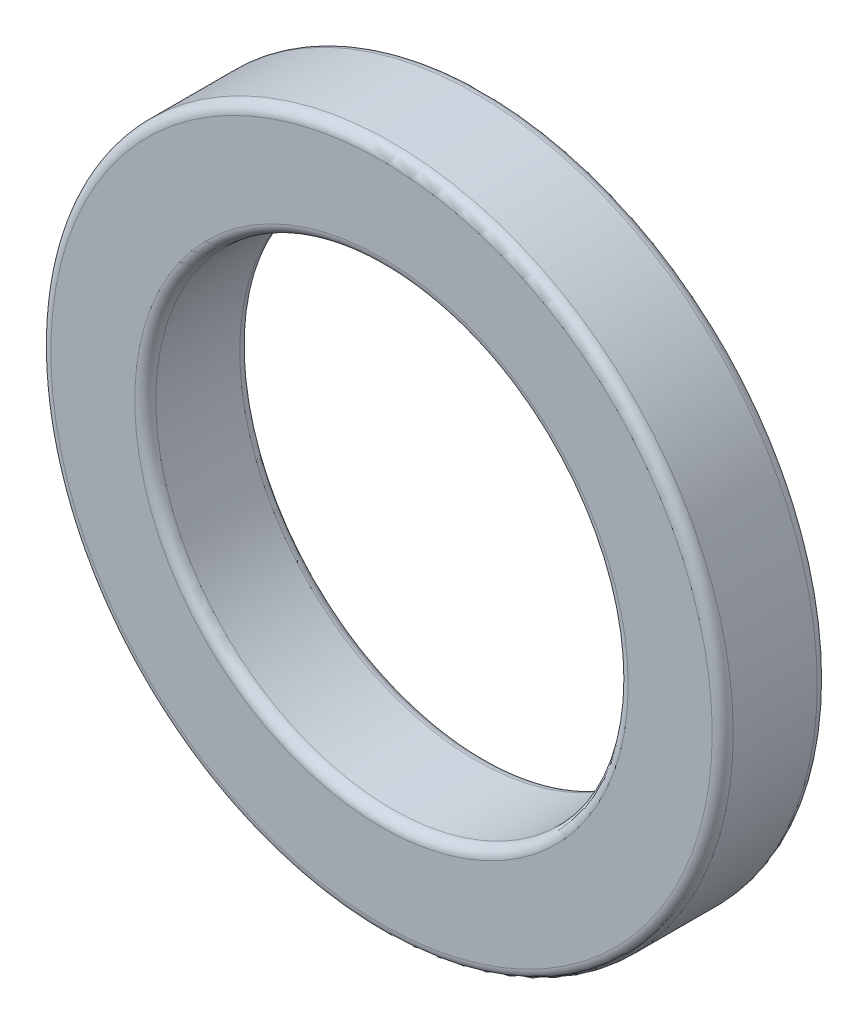
ISO-10303-21;
HEADER;
FILE_DESCRIPTION(('STEP AP214'),'2;1');
FILE_NAME('part.step','',(''),(''),'','','');
FILE_SCHEMA(('AUTOMOTIVE_DESIGN { 1 0 10303 214 1 1 1 1 }'));
ENDSEC;
DATA;
#1=APPLICATION_CONTEXT('core data for automotive mechanical design processes');
#2=APPLICATION_PROTOCOL_DEFINITION('international standard','automotive_design',2000,#1);
#3=PRODUCT_CONTEXT('',#1,'mechanical');
#4=PRODUCT('Part','Part','',(#3));
#5=PRODUCT_RELATED_PRODUCT_CATEGORY('part','',(#4));
#6=PRODUCT_DEFINITION_FORMATION('','',#4);
#7=PRODUCT_DEFINITION_CONTEXT('part definition',#1,'design');
#8=PRODUCT_DEFINITION('design','',#6,#7);
#9=PRODUCT_DEFINITION_SHAPE('','',#8);
#10=(LENGTH_UNIT() NAMED_UNIT(*) SI_UNIT(.MILLI.,.METRE.));
#11=(NAMED_UNIT(*) PLANE_ANGLE_UNIT() SI_UNIT($,.RADIAN.));
#12=(NAMED_UNIT(*) SI_UNIT($,.STERADIAN.) SOLID_ANGLE_UNIT());
#13=UNCERTAINTY_MEASURE_WITH_UNIT(LENGTH_MEASURE(1.E-05),#10,'distance_accuracy_value','');
#14=(GEOMETRIC_REPRESENTATION_CONTEXT(3) GLOBAL_UNCERTAINTY_ASSIGNED_CONTEXT((#13)) GLOBAL_UNIT_ASSIGNED_CONTEXT((#10,
#11,#12)) REPRESENTATION_CONTEXT('',''));
#15=CARTESIAN_POINT('',(0.,0.,0.));
#16=DIRECTION('',(0.,0.,1.));
#17=DIRECTION('',(1.,0.,0.));
#18=AXIS2_PLACEMENT_3D('',#15,#16,#17);
#19=CARTESIAN_POINT('',(0.,0.,2.));
#20=DIRECTION('',(0.,0.,1.));
#21=DIRECTION('',(1.,0.,0.));
#22=AXIS2_PLACEMENT_3D('',#19,#20,#21);
#23=PLANE('',#22);
#24=CARTESIAN_POINT('',(0.,0.,2.));
#25=DIRECTION('',(0.,0.,1.));
#26=DIRECTION('',(1.,0.,0.));
#27=AXIS2_PLACEMENT_3D('',#24,#25,#26);
#28=CIRCLE('',#27,6.3);
#29=CARTESIAN_POINT('',(6.3,0.,2.));
#30=VERTEX_POINT('',#29);
#31=EDGE_CURVE('E42',#30,#30,#28,.T.);
#32=ORIENTED_EDGE('',*,*,#31,.T.);
#33=EDGE_LOOP('',(#32));
#34=FACE_BOUND('',#33,.T.);
#35=CARTESIAN_POINT('',(0.,0.,2.));
#36=DIRECTION('',(0.,0.,1.));
#37=DIRECTION('',(1.,0.,0.));
#38=AXIS2_PLACEMENT_3D('',#35,#36,#37);
#39=CIRCLE('',#38,4.7);
#40=CARTESIAN_POINT('',(4.7,0.,2.));
#41=VERTEX_POINT('',#40);
#42=EDGE_CURVE('E46',#41,#41,#39,.F.);
#43=ORIENTED_EDGE('',*,*,#42,.T.);
#44=EDGE_LOOP('',(#43));
#45=FACE_BOUND('',#44,.T.);
#46=ADVANCED_FACE('F31',(#34,#45),#23,.T.);
#47=CARTESIAN_POINT('',(0.,0.,0.));
#48=DIRECTION('',(0.,0.,1.));
#49=DIRECTION('',(1.,0.,0.));
#50=AXIS2_PLACEMENT_3D('',#47,#48,#49);
#51=PLANE('',#50);
#52=CARTESIAN_POINT('',(0.,0.,0.));
#53=DIRECTION('',(0.,0.,1.));
#54=DIRECTION('',(1.,0.,0.));
#55=AXIS2_PLACEMENT_3D('',#52,#53,#54);
#56=CIRCLE('',#55,6.3);
#57=CARTESIAN_POINT('',(6.3,0.,0.));
#58=VERTEX_POINT('',#57);
#59=EDGE_CURVE('E51',#58,#58,#56,.F.);
#60=ORIENTED_EDGE('',*,*,#59,.T.);
#61=EDGE_LOOP('',(#60));
#62=FACE_BOUND('',#61,.T.);
#63=CARTESIAN_POINT('',(0.,0.,0.));
#64=DIRECTION('',(0.,0.,1.));
#65=DIRECTION('',(1.,0.,0.));
#66=AXIS2_PLACEMENT_3D('',#63,#64,#65);
#67=CIRCLE('',#66,4.7);
#68=CARTESIAN_POINT('',(4.7,0.,0.));
#69=VERTEX_POINT('',#68);
#70=EDGE_CURVE('E54',#69,#69,#67,.T.);
#71=ORIENTED_EDGE('',*,*,#70,.T.);
#72=EDGE_LOOP('',(#71));
#73=FACE_BOUND('',#72,.T.);
#74=ADVANCED_FACE('F76',(#62,#73),#51,.F.);
#75=CARTESIAN_POINT('',(0.,0.,2.));
#76=DIRECTION('',(0.,0.,-1.));
#77=DIRECTION('',(-1.,0.,0.));
#78=AXIS2_PLACEMENT_3D('',#75,#76,#77);
#79=CYLINDRICAL_SURFACE('',#78,6.5);
#80=CARTESIAN_POINT('',(0.,0.,0.2));
#81=DIRECTION('',(0.,0.,1.));
#82=DIRECTION('',(1.,0.,0.));
#83=AXIS2_PLACEMENT_3D('',#80,#81,#82);
#84=CIRCLE('',#83,6.5);
#85=CARTESIAN_POINT('',(6.5,0.,0.2));
#86=VERTEX_POINT('',#85);
#87=EDGE_CURVE('E57',#86,#86,#84,.T.);
#88=ORIENTED_EDGE('',*,*,#87,.T.);
#89=EDGE_LOOP('',(#88));
#90=FACE_BOUND('',#89,.T.);
#91=CARTESIAN_POINT('',(0.,0.,1.8));
#92=DIRECTION('',(0.,0.,1.));
#93=DIRECTION('',(1.,0.,0.));
#94=AXIS2_PLACEMENT_3D('',#91,#92,#93);
#95=CIRCLE('',#94,6.5);
#96=CARTESIAN_POINT('',(6.5,0.,1.8));
#97=VERTEX_POINT('',#96);
#98=EDGE_CURVE('E60',#97,#97,#95,.F.);
#99=ORIENTED_EDGE('',*,*,#98,.T.);
#100=EDGE_LOOP('',(#99));
#101=FACE_BOUND('',#100,.T.);
#102=ADVANCED_FACE('F64',(#90,#101),#79,.T.);
#103=CARTESIAN_POINT('',(0.,0.,2.));
#104=DIRECTION('',(0.,0.,-1.));
#105=DIRECTION('',(-1.,0.,0.));
#106=AXIS2_PLACEMENT_3D('',#103,#104,#105);
#107=CYLINDRICAL_SURFACE('',#106,4.5);
#108=CARTESIAN_POINT('',(0.,0.,0.2));
#109=DIRECTION('',(0.,0.,1.));
#110=DIRECTION('',(1.,0.,0.));
#111=AXIS2_PLACEMENT_3D('',#108,#109,#110);
#112=CIRCLE('',#111,4.5);
#113=CARTESIAN_POINT('',(4.5,0.,0.2));
#114=VERTEX_POINT('',#113);
#115=EDGE_CURVE('E10',#114,#114,#112,.F.);
#116=ORIENTED_EDGE('',*,*,#115,.T.);
#117=EDGE_LOOP('',(#116));
#118=FACE_BOUND('',#117,.T.);
#119=CARTESIAN_POINT('',(0.,0.,1.8));
#120=DIRECTION('',(0.,0.,1.));
#121=DIRECTION('',(1.,0.,0.));
#122=AXIS2_PLACEMENT_3D('',#119,#120,#121);
#123=CIRCLE('',#122,4.5);
#124=CARTESIAN_POINT('',(4.5,0.,1.8));
#125=VERTEX_POINT('',#124);
#126=EDGE_CURVE('E38',#125,#125,#123,.T.);
#127=ORIENTED_EDGE('',*,*,#126,.T.);
#128=EDGE_LOOP('',(#127));
#129=FACE_BOUND('',#128,.T.);
#130=ADVANCED_FACE('F92',(#118,#129),#107,.F.);
#131=CARTESIAN_POINT('',(0.,0.,0.2));
#132=DIRECTION('',(0.,0.,1.));
#133=DIRECTION('',(1.,0.,0.));
#134=AXIS2_PLACEMENT_3D('',#131,#132,#133);
#135=TOROIDAL_SURFACE('',#134,6.3,0.2);
#136=ORIENTED_EDGE('',*,*,#59,.F.);
#137=EDGE_LOOP('',(#136));
#138=FACE_BOUND('',#137,.T.);
#139=ORIENTED_EDGE('',*,*,#87,.F.);
#140=EDGE_LOOP('',(#139));
#141=FACE_BOUND('',#140,.T.);
#142=ADVANCED_FACE('F70',(#138,#141),#135,.T.);
#143=CARTESIAN_POINT('',(0.,0.,1.8));
#144=DIRECTION('',(0.,0.,1.));
#145=DIRECTION('',(1.,0.,0.));
#146=AXIS2_PLACEMENT_3D('',#143,#144,#145);
#147=TOROIDAL_SURFACE('',#146,6.3,0.2);
#148=ORIENTED_EDGE('',*,*,#98,.F.);
#149=EDGE_LOOP('',(#148));
#150=FACE_BOUND('',#149,.T.);
#151=ORIENTED_EDGE('',*,*,#31,.F.);
#152=EDGE_LOOP('',(#151));
#153=FACE_BOUND('',#152,.T.);
#154=ADVANCED_FACE('F66',(#150,#153),#147,.T.);
#155=CARTESIAN_POINT('',(0.,0.,0.2));
#156=DIRECTION('',(0.,0.,1.));
#157=DIRECTION('',(1.,0.,0.));
#158=AXIS2_PLACEMENT_3D('',#155,#156,#157);
#159=TOROIDAL_SURFACE('',#158,4.7,0.2);
#160=ORIENTED_EDGE('',*,*,#115,.F.);
#161=EDGE_LOOP('',(#160));
#162=FACE_BOUND('',#161,.T.);
#163=ORIENTED_EDGE('',*,*,#70,.F.);
#164=EDGE_LOOP('',(#163));
#165=FACE_BOUND('',#164,.T.);
#166=ADVANCED_FACE('F69',(#162,#165),#159,.T.);
#167=CARTESIAN_POINT('',(0.,0.,1.8));
#168=DIRECTION('',(0.,0.,1.));
#169=DIRECTION('',(1.,0.,0.));
#170=AXIS2_PLACEMENT_3D('',#167,#168,#169);
#171=TOROIDAL_SURFACE('',#170,4.7,0.2);
#172=ORIENTED_EDGE('',*,*,#42,.F.);
#173=EDGE_LOOP('',(#172));
#174=FACE_BOUND('',#173,.T.);
#175=ORIENTED_EDGE('',*,*,#126,.F.);
#176=EDGE_LOOP('',(#175));
#177=FACE_BOUND('',#176,.T.);
#178=ADVANCED_FACE('F33',(#174,#177),#171,.T.);
#179=CLOSED_SHELL('',(#46,#74,#102,#130,#142,#154,#166,#178));
#180=MANIFOLD_SOLID_BREP('B2',#179);
#181=ADVANCED_BREP_SHAPE_REPRESENTATION('',(#18,#180),#14);
#182=SHAPE_DEFINITION_REPRESENTATION(#9,#181);
ENDSEC;
END-ISO-10303-21;
